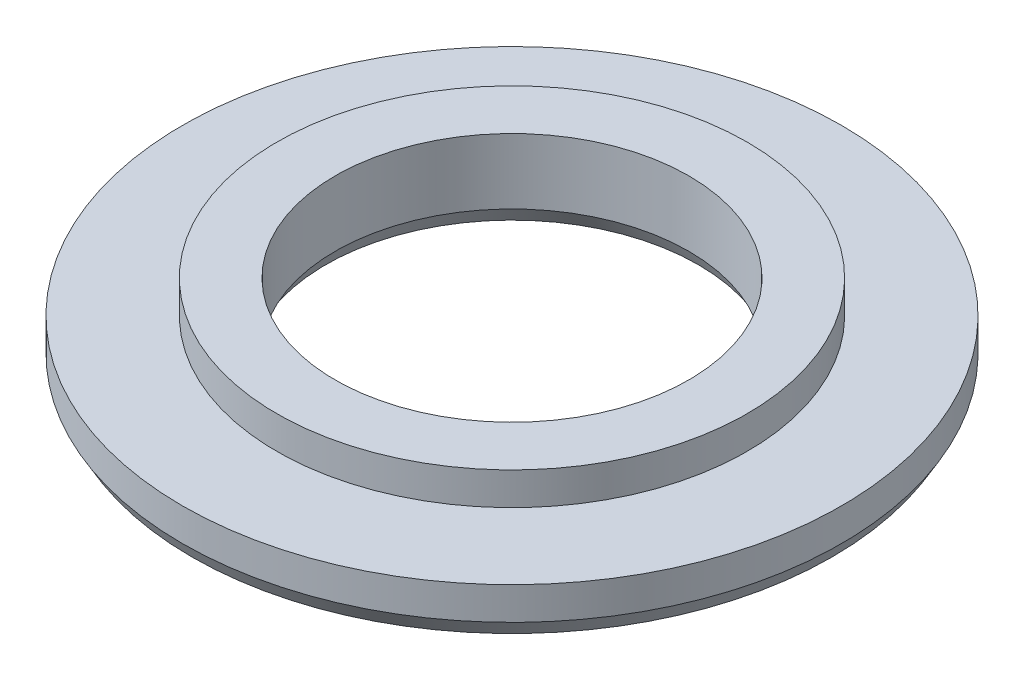
ISO-10303-21;
HEADER;
FILE_DESCRIPTION(('STEP AP214'),'2;1');
FILE_NAME('part.step','',(''),(''),'','','');
FILE_SCHEMA(('AUTOMOTIVE_DESIGN { 1 0 10303 214 1 1 1 1 }'));
ENDSEC;
DATA;
#1=APPLICATION_CONTEXT('core data for automotive mechanical design processes');
#2=APPLICATION_PROTOCOL_DEFINITION('international standard','automotive_design',2000,#1);
#3=PRODUCT_CONTEXT('',#1,'mechanical');
#4=PRODUCT('Part','Part','',(#3));
#5=PRODUCT_RELATED_PRODUCT_CATEGORY('part','',(#4));
#6=PRODUCT_DEFINITION_FORMATION('','',#4);
#7=PRODUCT_DEFINITION_CONTEXT('part definition',#1,'design');
#8=PRODUCT_DEFINITION('design','',#6,#7);
#9=PRODUCT_DEFINITION_SHAPE('','',#8);
#10=(LENGTH_UNIT() NAMED_UNIT(*) SI_UNIT(.MILLI.,.METRE.));
#11=(NAMED_UNIT(*) PLANE_ANGLE_UNIT() SI_UNIT($,.RADIAN.));
#12=(NAMED_UNIT(*) SI_UNIT($,.STERADIAN.) SOLID_ANGLE_UNIT());
#13=UNCERTAINTY_MEASURE_WITH_UNIT(LENGTH_MEASURE(1.E-05),#10,'distance_accuracy_value','');
#14=(GEOMETRIC_REPRESENTATION_CONTEXT(3) GLOBAL_UNCERTAINTY_ASSIGNED_CONTEXT((#13)) GLOBAL_UNIT_ASSIGNED_CONTEXT((#10,
#11,#12)) REPRESENTATION_CONTEXT('',''));
#15=CARTESIAN_POINT('',(0.,0.,0.));
#16=DIRECTION('',(0.,0.,1.));
#17=DIRECTION('',(1.,0.,0.));
#18=AXIS2_PLACEMENT_3D('',#15,#16,#17);
#19=CARTESIAN_POINT('',(0.,0.,0.));
#20=DIRECTION('',(0.,-1.,0.));
#21=DIRECTION('',(0.,0.,-1.));
#22=AXIS2_PLACEMENT_3D('',#19,#20,#21);
#23=CYLINDRICAL_SURFACE('',#22,10.825);
#24=CARTESIAN_POINT('',(0.,5.,0.));
#25=DIRECTION('',(0.,-1.,0.));
#26=DIRECTION('',(0.,0.,-1.));
#27=AXIS2_PLACEMENT_3D('',#24,#25,#26);
#28=CIRCLE('',#27,10.825);
#29=CARTESIAN_POINT('',(0.,5.,-10.825));
#30=VERTEX_POINT('',#29);
#31=EDGE_CURVE('E11',#30,#30,#28,.T.);
#32=ORIENTED_EDGE('',*,*,#31,.F.);
#33=EDGE_LOOP('',(#32));
#34=FACE_BOUND('',#33,.T.);
#35=CARTESIAN_POINT('',(0.,1.,0.));
#36=DIRECTION('',(0.,-1.,0.));
#37=DIRECTION('',(0.,0.,-1.));
#38=AXIS2_PLACEMENT_3D('',#35,#36,#37);
#39=CIRCLE('',#38,10.825);
#40=CARTESIAN_POINT('',(0.,1.,-10.825));
#41=VERTEX_POINT('',#40);
#42=EDGE_CURVE('E167',#41,#41,#39,.T.);
#43=ORIENTED_EDGE('',*,*,#42,.T.);
#44=EDGE_LOOP('',(#43));
#45=FACE_BOUND('',#44,.T.);
#46=ADVANCED_FACE('F16',(#34,#45),#23,.F.);
#47=CARTESIAN_POINT('',(0.,5.,14.4));
#48=DIRECTION('',(0.,1.,0.));
#49=DIRECTION('',(1.,0.,0.));
#50=AXIS2_PLACEMENT_3D('',#47,#48,#49);
#51=PLANE('',#50);
#52=CARTESIAN_POINT('',(0.,5.,0.));
#53=DIRECTION('',(0.,-1.,0.));
#54=DIRECTION('',(0.,0.,-1.));
#55=AXIS2_PLACEMENT_3D('',#52,#53,#54);
#56=CIRCLE('',#55,14.4);
#57=CARTESIAN_POINT('',(0.,5.,-14.4));
#58=VERTEX_POINT('',#57);
#59=EDGE_CURVE('E24',#58,#58,#56,.T.);
#60=ORIENTED_EDGE('',*,*,#59,.F.);
#61=EDGE_LOOP('',(#60));
#62=FACE_BOUND('',#61,.T.);
#63=ORIENTED_EDGE('',*,*,#31,.T.);
#64=EDGE_LOOP('',(#63));
#65=FACE_BOUND('',#64,.T.);
#66=ADVANCED_FACE('F130',(#62,#65),#51,.T.);
#67=CARTESIAN_POINT('',(0.,0.,0.));
#68=DIRECTION('',(0.,-1.,0.));
#69=DIRECTION('',(0.,0.,-1.));
#70=AXIS2_PLACEMENT_3D('',#67,#68,#69);
#71=CYLINDRICAL_SURFACE('',#70,14.4);
#72=CARTESIAN_POINT('',(0.,3.,0.));
#73=DIRECTION('',(0.,-1.,0.));
#74=DIRECTION('',(0.,0.,-1.));
#75=AXIS2_PLACEMENT_3D('',#72,#73,#74);
#76=CIRCLE('',#75,14.4);
#77=CARTESIAN_POINT('',(0.,3.,-14.4));
#78=VERTEX_POINT('',#77);
#79=EDGE_CURVE('E69',#78,#78,#76,.T.);
#80=ORIENTED_EDGE('',*,*,#79,.F.);
#81=EDGE_LOOP('',(#80));
#82=FACE_BOUND('',#81,.T.);
#83=ORIENTED_EDGE('',*,*,#59,.T.);
#84=EDGE_LOOP('',(#83));
#85=FACE_BOUND('',#84,.T.);
#86=ADVANCED_FACE('F91',(#82,#85),#71,.T.);
#87=CARTESIAN_POINT('',(0.,3.,20.175));
#88=DIRECTION('',(0.,1.,0.));
#89=DIRECTION('',(1.,0.,0.));
#90=AXIS2_PLACEMENT_3D('',#87,#88,#89);
#91=PLANE('',#90);
#92=CARTESIAN_POINT('',(0.,3.,0.));
#93=DIRECTION('',(0.,-1.,0.));
#94=DIRECTION('',(0.,0.,-1.));
#95=AXIS2_PLACEMENT_3D('',#92,#93,#94);
#96=CIRCLE('',#95,20.175);
#97=CARTESIAN_POINT('',(0.,3.,-20.175));
#98=VERTEX_POINT('',#97);
#99=EDGE_CURVE('E65',#98,#98,#96,.T.);
#100=ORIENTED_EDGE('',*,*,#99,.F.);
#101=EDGE_LOOP('',(#100));
#102=FACE_BOUND('',#101,.T.);
#103=ORIENTED_EDGE('',*,*,#79,.T.);
#104=EDGE_LOOP('',(#103));
#105=FACE_BOUND('',#104,.T.);
#106=ADVANCED_FACE('F86',(#102,#105),#91,.T.);
#107=CARTESIAN_POINT('',(0.,0.,0.));
#108=DIRECTION('',(0.,-1.,0.));
#109=DIRECTION('',(0.,0.,-1.));
#110=AXIS2_PLACEMENT_3D('',#107,#108,#109);
#111=CYLINDRICAL_SURFACE('',#110,20.175);
#112=CARTESIAN_POINT('',(0.,1.,0.));
#113=DIRECTION('',(0.,-1.,0.));
#114=DIRECTION('',(0.,0.,-1.));
#115=AXIS2_PLACEMENT_3D('',#112,#113,#114);
#116=CIRCLE('',#115,20.175);
#117=CARTESIAN_POINT('',(0.,1.,-20.175));
#118=VERTEX_POINT('',#117);
#119=EDGE_CURVE('E70',#118,#118,#116,.T.);
#120=ORIENTED_EDGE('',*,*,#119,.F.);
#121=EDGE_LOOP('',(#120));
#122=FACE_BOUND('',#121,.T.);
#123=ORIENTED_EDGE('',*,*,#99,.T.);
#124=EDGE_LOOP('',(#123));
#125=FACE_BOUND('',#124,.T.);
#126=ADVANCED_FACE('F66',(#122,#125),#111,.T.);
#127=CARTESIAN_POINT('',(0.,0.,0.));
#128=DIRECTION('',(0.,1.,0.));
#129=DIRECTION('',(0.,0.,1.));
#130=AXIS2_PLACEMENT_3D('',#127,#128,#129);
#131=CONICAL_SURFACE('',#130,19.5976497308104,0.523598775);
#132=CARTESIAN_POINT('',(0.,0.,0.));
#133=DIRECTION('',(0.,-1.,0.));
#134=DIRECTION('',(0.,0.,-1.));
#135=AXIS2_PLACEMENT_3D('',#132,#133,#134);
#136=CIRCLE('',#135,19.5976497308104);
#137=CARTESIAN_POINT('',(0.,0.,-19.5976497308104));
#138=VERTEX_POINT('',#137);
#139=EDGE_CURVE('E78',#138,#138,#136,.T.);
#140=ORIENTED_EDGE('',*,*,#139,.F.);
#141=EDGE_LOOP('',(#140));
#142=FACE_BOUND('',#141,.T.);
#143=ORIENTED_EDGE('',*,*,#119,.T.);
#144=EDGE_LOOP('',(#143));
#145=FACE_BOUND('',#144,.T.);
#146=ADVANCED_FACE('F108',(#142,#145),#131,.T.);
#147=CARTESIAN_POINT('',(0.,0.,11.4023502691896));
#148=DIRECTION('',(0.,-1.,0.));
#149=DIRECTION('',(0.,0.,-1.));
#150=AXIS2_PLACEMENT_3D('',#147,#148,#149);
#151=PLANE('',#150);
#152=CARTESIAN_POINT('',(0.,0.,0.));
#153=DIRECTION('',(0.,-1.,0.));
#154=DIRECTION('',(0.,0.,-1.));
#155=AXIS2_PLACEMENT_3D('',#152,#153,#154);
#156=CIRCLE('',#155,11.4023502691896);
#157=CARTESIAN_POINT('',(0.,0.,-11.4023502691896));
#158=VERTEX_POINT('',#157);
#159=EDGE_CURVE('E169',#158,#158,#156,.T.);
#160=ORIENTED_EDGE('',*,*,#159,.F.);
#161=EDGE_LOOP('',(#160));
#162=FACE_BOUND('',#161,.T.);
#163=ORIENTED_EDGE('',*,*,#139,.T.);
#164=EDGE_LOOP('',(#163));
#165=FACE_BOUND('',#164,.T.);
#166=ADVANCED_FACE('F100',(#162,#165),#151,.T.);
#167=CARTESIAN_POINT('',(0.,1.,0.));
#168=DIRECTION('',(0.,-1.,0.));
#169=DIRECTION('',(0.,0.,-1.));
#170=AXIS2_PLACEMENT_3D('',#167,#168,#169);
#171=CONICAL_SURFACE('',#170,10.825,0.523598775);
#172=ORIENTED_EDGE('',*,*,#42,.F.);
#173=EDGE_LOOP('',(#172));
#174=FACE_BOUND('',#173,.T.);
#175=ORIENTED_EDGE('',*,*,#159,.T.);
#176=EDGE_LOOP('',(#175));
#177=FACE_BOUND('',#176,.T.);
#178=ADVANCED_FACE('F96',(#174,#177),#171,.F.);
#179=CLOSED_SHELL('',(#46,#66,#86,#106,#126,#146,#166,#178));
#180=MANIFOLD_SOLID_BREP('B1',#179);
#181=ADVANCED_BREP_SHAPE_REPRESENTATION('',(#18,#180),#14);
#182=SHAPE_DEFINITION_REPRESENTATION(#9,#181);
ENDSEC;
END-ISO-10303-21;
